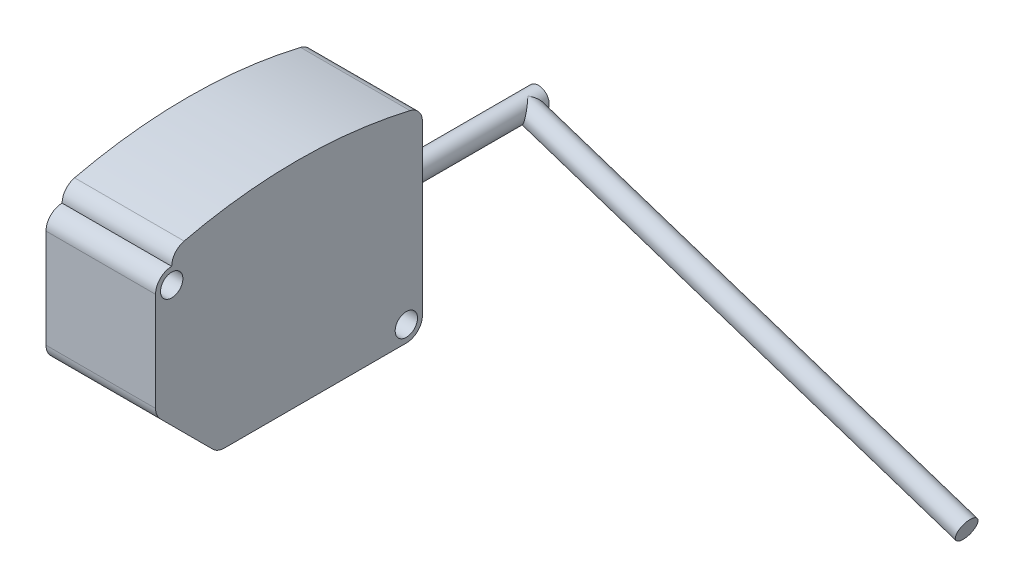
ISO-10303-21;
HEADER;
FILE_DESCRIPTION(('STEP AP214'),'2;1');
FILE_NAME('part.step','',(''),(''),'','','');
FILE_SCHEMA(('AUTOMOTIVE_DESIGN { 1 0 10303 214 1 1 1 1 }'));
ENDSEC;
DATA;
#1=APPLICATION_CONTEXT('core data for automotive mechanical design processes');
#2=APPLICATION_PROTOCOL_DEFINITION('international standard','automotive_design',2000,#1);
#3=PRODUCT_CONTEXT('',#1,'mechanical');
#4=PRODUCT('Part','Part','',(#3));
#5=PRODUCT_RELATED_PRODUCT_CATEGORY('part','',(#4));
#6=PRODUCT_DEFINITION_FORMATION('','',#4);
#7=PRODUCT_DEFINITION_CONTEXT('part definition',#1,'design');
#8=PRODUCT_DEFINITION('design','',#6,#7);
#9=PRODUCT_DEFINITION_SHAPE('','',#8);
#10=(LENGTH_UNIT() NAMED_UNIT(*) SI_UNIT(.MILLI.,.METRE.));
#11=(NAMED_UNIT(*) PLANE_ANGLE_UNIT() SI_UNIT($,.RADIAN.));
#12=(NAMED_UNIT(*) SI_UNIT($,.STERADIAN.) SOLID_ANGLE_UNIT());
#13=UNCERTAINTY_MEASURE_WITH_UNIT(LENGTH_MEASURE(1.E-05),#10,'distance_accuracy_value','');
#14=(GEOMETRIC_REPRESENTATION_CONTEXT(3) GLOBAL_UNCERTAINTY_ASSIGNED_CONTEXT((#13)) GLOBAL_UNIT_ASSIGNED_CONTEXT((#10,
#11,#12)) REPRESENTATION_CONTEXT('',''));
#15=CARTESIAN_POINT('',(0.,0.,0.));
#16=DIRECTION('',(0.,0.,1.));
#17=DIRECTION('',(1.,0.,0.));
#18=AXIS2_PLACEMENT_3D('',#15,#16,#17);
#19=CARTESIAN_POINT('',(0.,29.5,-55.));
#20=DIRECTION('',(0.,0.,1.));
#21=DIRECTION('',(0.,-1.,0.));
#22=AXIS2_PLACEMENT_3D('',#19,#20,#21);
#23=CYLINDRICAL_SURFACE('',#22,3.5);
#24=CARTESIAN_POINT('',(0.,29.5,0.));
#25=DIRECTION('',(0.,0.,1.));
#26=DIRECTION('',(0.,-1.,0.));
#27=AXIS2_PLACEMENT_3D('',#24,#25,#26);
#28=CIRCLE('',#27,3.5);
#29=CARTESIAN_POINT('',(0.,26.,0.));
#30=VERTEX_POINT('',#29);
#31=EDGE_CURVE('E202',#30,#30,#28,.F.);
#32=ORIENTED_EDGE('',*,*,#31,.T.);
#33=EDGE_LOOP('',(#32));
#34=FACE_BOUND('',#33,.T.);
#35=CARTESIAN_POINT('',(0.,29.5,-55.));
#36=DIRECTION('',(0.,0.,-1.));
#37=DIRECTION('',(0.,1.,0.));
#38=AXIS2_PLACEMENT_3D('',#35,#36,#37);
#39=CIRCLE('',#38,3.5);
#40=CARTESIAN_POINT('',(0.,33.,-55.));
#41=VERTEX_POINT('',#40);
#42=EDGE_CURVE('E369',#41,#41,#39,.T.);
#43=ORIENTED_EDGE('',*,*,#42,.F.);
#44=EDGE_LOOP('',(#43));
#45=FACE_BOUND('',#44,.T.);
#46=CARTESIAN_POINT('',(0.,29.5,-50.5154843800657));
#47=DIRECTION('',(-0.671564955952915,0.221360588036713,0.707106781186548));
#48=DIRECTION('',(0.671564955952915,-0.221360588036714,0.707106781186547));
#49=AXIS2_PLACEMENT_3D('',#46,#47,#48);
#50=ELLIPSE('',#49,4.94974746830583,3.5);
#51=CARTESIAN_POINT('',(1.09567901021741,32.8240769405309,-50.5154843800657));
#52=VERTEX_POINT('',#51);
#53=CARTESIAN_POINT('',(-1.09567901021742,26.1759230594692,-50.5154843800657));
#54=VERTEX_POINT('',#53);
#55=EDGE_CURVE('E11',#52,#54,#50,.F.);
#56=ORIENTED_EDGE('',*,*,#55,.F.);
#57=CARTESIAN_POINT('',(0.,29.5,-50.5154843800657));
#58=DIRECTION('',(0.671564955952915,-0.221360588036714,0.707106781186547));
#59=DIRECTION('',(-0.671564955952915,0.221360588036713,0.707106781186548));
#60=AXIS2_PLACEMENT_3D('',#57,#58,#59);
#61=ELLIPSE('',#60,4.94974746830583,3.5);
#62=EDGE_CURVE('E41',#54,#52,#61,.T.);
#63=ORIENTED_EDGE('',*,*,#62,.F.);
#64=EDGE_LOOP('',(#56,#63));
#65=FACE_BOUND('',#64,.T.);
#66=ADVANCED_FACE('F33',(#34,#45,#65),#23,.T.);
#67=CARTESIAN_POINT('',(17.65,59.2,0.));
#68=DIRECTION('',(0.,0.,1.));
#69=DIRECTION('',(0.,-1.,0.));
#70=AXIS2_PLACEMENT_3D('',#67,#68,#69);
#71=PLANE('',#70);
#72=DIRECTION('',(0.,1.,0.));
#73=VECTOR('',#72,1.);
#74=CARTESIAN_POINT('',(-17.65,59.2,0.));
#75=LINE('',#74,#73);
#76=CARTESIAN_POINT('',(-17.65,5.2,0.));
#77=VERTEX_POINT('',#76);
#78=CARTESIAN_POINT('',(-17.65,59.2,0.));
#79=VERTEX_POINT('',#78);
#80=EDGE_CURVE('E172',#77,#79,#75,.T.);
#81=ORIENTED_EDGE('',*,*,#80,.T.);
#82=DIRECTION('',(-1.,0.,0.));
#83=VECTOR('',#82,1.);
#84=CARTESIAN_POINT('',(17.65,59.2,0.));
#85=LINE('',#84,#83);
#86=CARTESIAN_POINT('',(17.65,59.2,0.));
#87=VERTEX_POINT('',#86);
#88=EDGE_CURVE('E147',#87,#79,#85,.T.);
#89=ORIENTED_EDGE('',*,*,#88,.F.);
#90=DIRECTION('',(0.,1.,0.));
#91=VECTOR('',#90,1.);
#92=CARTESIAN_POINT('',(17.65,59.2,0.));
#93=LINE('',#92,#91);
#94=CARTESIAN_POINT('',(17.65,5.2,0.));
#95=VERTEX_POINT('',#94);
#96=EDGE_CURVE('E135',#95,#87,#93,.T.);
#97=ORIENTED_EDGE('',*,*,#96,.F.);
#98=DIRECTION('',(-1.,0.,0.));
#99=VECTOR('',#98,1.);
#100=CARTESIAN_POINT('',(17.65,5.2,0.));
#101=LINE('',#100,#99);
#102=EDGE_CURVE('E182',#95,#77,#101,.T.);
#103=ORIENTED_EDGE('',*,*,#102,.T.);
#104=EDGE_LOOP('',(#81,#89,#97,#103));
#105=FACE_BOUND('',#104,.T.);
#106=ORIENTED_EDGE('',*,*,#31,.F.);
#107=EDGE_LOOP('',(#106));
#108=FACE_BOUND('',#107,.T.);
#109=ADVANCED_FACE('F225',(#105,#108),#71,.F.);
#110=CARTESIAN_POINT('',(-17.65,54.,80.8));
#111=DIRECTION('',(1.,0.,0.));
#112=DIRECTION('',(0.,0.,-1.));
#113=AXIS2_PLACEMENT_3D('',#110,#111,#112);
#114=PLANE('',#113);
#115=CARTESIAN_POINT('',(-17.65,54.,80.8));
#116=DIRECTION('',(1.,0.,0.));
#117=DIRECTION('',(0.,0.,-1.));
#118=AXIS2_PLACEMENT_3D('',#115,#116,#117);
#119=CIRCLE('',#118,3.6);
#120=CARTESIAN_POINT('',(-17.65,54.,77.2));
#121=VERTEX_POINT('',#120);
#122=EDGE_CURVE('E219',#121,#121,#119,.T.);
#123=ORIENTED_EDGE('',*,*,#122,.T.);
#124=EDGE_LOOP('',(#123));
#125=FACE_BOUND('',#124,.T.);
#126=CARTESIAN_POINT('',(-17.65,54.,80.8));
#127=DIRECTION('',(1.,0.,0.));
#128=DIRECTION('',(0.,0.,-1.));
#129=AXIS2_PLACEMENT_3D('',#126,#127,#128);
#130=CIRCLE('',#129,5.19999999999999);
#131=CARTESIAN_POINT('',(-17.65,59.2,80.8));
#132=VERTEX_POINT('',#131);
#133=CARTESIAN_POINT('',(-17.65,54.,86.));
#134=VERTEX_POINT('',#133);
#135=EDGE_CURVE('E156',#132,#134,#130,.T.);
#136=ORIENTED_EDGE('',*,*,#135,.F.);
#137=CARTESIAN_POINT('',(-17.65,59.2,75.6));
#138=DIRECTION('',(1.,0.,0.));
#139=DIRECTION('',(0.,0.,-1.));
#140=AXIS2_PLACEMENT_3D('',#137,#138,#139);
#141=CIRCLE('',#140,5.2);
#142=CARTESIAN_POINT('',(-17.65,64.2607922920731,76.7951491022017));
#143=VERTEX_POINT('',#142);
#144=EDGE_CURVE('E96',#143,#132,#141,.T.);
#145=ORIENTED_EDGE('',*,*,#144,.F.);
#146=CARTESIAN_POINT('',(-17.65,-89.8524390243884,40.3999999999999));
#147=DIRECTION('',(1.,0.,0.));
#148=DIRECTION('',(0.,0.,-1.));
#149=AXIS2_PLACEMENT_3D('',#146,#147,#148);
#150=CIRCLE('',#149,158.352439024388);
#151=CARTESIAN_POINT('',(-17.65,64.2607922920731,4.00485089779829));
#152=VERTEX_POINT('',#151);
#153=EDGE_CURVE('E175',#152,#143,#150,.T.);
#154=ORIENTED_EDGE('',*,*,#153,.F.);
#155=CARTESIAN_POINT('',(-17.65,59.2,5.19999999999999));
#156=DIRECTION('',(1.,0.,0.));
#157=DIRECTION('',(0.,0.,1.));
#158=AXIS2_PLACEMENT_3D('',#155,#156,#157);
#159=CIRCLE('',#158,5.19999999999999);
#160=EDGE_CURVE('E144',#79,#152,#159,.T.);
#161=ORIENTED_EDGE('',*,*,#160,.F.);
#162=ORIENTED_EDGE('',*,*,#80,.F.);
#163=CARTESIAN_POINT('',(-17.65,5.2,5.2));
#164=DIRECTION('',(1.,0.,0.));
#165=DIRECTION('',(0.,0.,1.));
#166=AXIS2_PLACEMENT_3D('',#163,#164,#165);
#167=CIRCLE('',#166,5.2);
#168=CARTESIAN_POINT('',(-17.65,0.,5.19999999999999));
#169=VERTEX_POINT('',#168);
#170=EDGE_CURVE('E170',#169,#77,#167,.T.);
#171=ORIENTED_EDGE('',*,*,#170,.F.);
#172=DIRECTION('',(0.,0.,-1.));
#173=VECTOR('',#172,1.);
#174=CARTESIAN_POINT('',(-17.65,0.,5.19999999999999));
#175=LINE('',#174,#173);
#176=CARTESIAN_POINT('',(-17.65,0.,63.8460894756599));
#177=VERTEX_POINT('',#176);
#178=EDGE_CURVE('E168',#177,#169,#175,.T.);
#179=ORIENTED_EDGE('',*,*,#178,.F.);
#180=CARTESIAN_POINT('',(-17.65,5.19999999999999,63.8460894756599));
#181=DIRECTION('',(1.,0.,0.));
#182=DIRECTION('',(0.,0.,-1.));
#183=AXIS2_PLACEMENT_3D('',#180,#181,#182);
#184=CIRCLE('',#183,5.2);
#185=CARTESIAN_POINT('',(-17.65,1.52304473782994,67.5230447378299));
#186=VERTEX_POINT('',#185);
#187=EDGE_CURVE('E166',#186,#177,#184,.T.);
#188=ORIENTED_EDGE('',*,*,#187,.F.);
#189=DIRECTION('',(0.,-0.707106781186547,-0.707106781186548));
#190=VECTOR('',#189,1.);
#191=CARTESIAN_POINT('',(-17.65,1.52304473782994,67.5230447378299));
#192=LINE('',#191,#190);
#193=CARTESIAN_POINT('',(-17.65,18.47695526217,84.47695526217));
#194=VERTEX_POINT('',#193);
#195=EDGE_CURVE('E164',#194,#186,#192,.T.);
#196=ORIENTED_EDGE('',*,*,#195,.F.);
#197=CARTESIAN_POINT('',(-17.65,22.1539105243401,80.8));
#198=DIRECTION('',(1.,0.,0.));
#199=DIRECTION('',(0.,0.,1.));
#200=AXIS2_PLACEMENT_3D('',#197,#198,#199);
#201=CIRCLE('',#200,5.2);
#202=CARTESIAN_POINT('',(-17.65,22.1539105243401,86.));
#203=VERTEX_POINT('',#202);
#204=EDGE_CURVE('E162',#203,#194,#201,.T.);
#205=ORIENTED_EDGE('',*,*,#204,.F.);
#206=DIRECTION('',(0.,-1.,0.));
#207=VECTOR('',#206,1.);
#208=CARTESIAN_POINT('',(-17.65,22.1539105243401,86.));
#209=LINE('',#208,#207);
#210=EDGE_CURVE('E159',#134,#203,#209,.T.);
#211=ORIENTED_EDGE('',*,*,#210,.F.);
#212=EDGE_LOOP('',(#136,#145,#154,#161,#162,#171,#179,#188,#196,#205,#211));
#213=FACE_BOUND('',#212,.T.);
#214=CARTESIAN_POINT('',(-17.65,5.2,5.2));
#215=DIRECTION('',(1.,0.,0.));
#216=DIRECTION('',(0.,0.,-1.));
#217=AXIS2_PLACEMENT_3D('',#214,#215,#216);
#218=CIRCLE('',#217,3.6);
#219=CARTESIAN_POINT('',(-17.65,5.2,1.6));
#220=VERTEX_POINT('',#219);
#221=EDGE_CURVE('E366',#220,#220,#218,.T.);
#222=ORIENTED_EDGE('',*,*,#221,.T.);
#223=EDGE_LOOP('',(#222));
#224=FACE_BOUND('',#223,.T.);
#225=ADVANCED_FACE('F233',(#125,#213,#224),#114,.F.);
#226=CARTESIAN_POINT('',(17.65,5.2,5.2));
#227=DIRECTION('',(-1.,0.,0.));
#228=DIRECTION('',(0.,0.,1.));
#229=AXIS2_PLACEMENT_3D('',#226,#227,#228);
#230=CYLINDRICAL_SURFACE('',#229,2.25);
#231=CARTESIAN_POINT('',(11.65,5.2,5.2));
#232=DIRECTION('',(1.,0.,0.));
#233=DIRECTION('',(0.,0.,-1.));
#234=AXIS2_PLACEMENT_3D('',#231,#232,#233);
#235=CIRCLE('',#234,2.25);
#236=CARTESIAN_POINT('',(11.65,5.2,2.95));
#237=VERTEX_POINT('',#236);
#238=EDGE_CURVE('E206',#237,#237,#235,.T.);
#239=ORIENTED_EDGE('',*,*,#238,.T.);
#240=EDGE_LOOP('',(#239));
#241=FACE_BOUND('',#240,.T.);
#242=CARTESIAN_POINT('',(-11.65,5.2,5.2));
#243=DIRECTION('',(-1.,0.,0.));
#244=DIRECTION('',(0.,0.,1.));
#245=AXIS2_PLACEMENT_3D('',#242,#243,#244);
#246=CIRCLE('',#245,2.25);
#247=CARTESIAN_POINT('',(-11.65,5.2,7.45));
#248=VERTEX_POINT('',#247);
#249=EDGE_CURVE('E216',#248,#248,#246,.T.);
#250=ORIENTED_EDGE('',*,*,#249,.T.);
#251=EDGE_LOOP('',(#250));
#252=FACE_BOUND('',#251,.T.);
#253=ADVANCED_FACE('F274',(#241,#252),#230,.F.);
#254=CARTESIAN_POINT('',(17.65,54.,80.8));
#255=DIRECTION('',(-1.,0.,0.));
#256=DIRECTION('',(0.,0.,1.));
#257=AXIS2_PLACEMENT_3D('',#254,#255,#256);
#258=CYLINDRICAL_SURFACE('',#257,2.25);
#259=CARTESIAN_POINT('',(11.65,54.,80.8));
#260=DIRECTION('',(1.,0.,0.));
#261=DIRECTION('',(0.,0.,-1.));
#262=AXIS2_PLACEMENT_3D('',#259,#260,#261);
#263=CIRCLE('',#262,2.25);
#264=CARTESIAN_POINT('',(11.65,54.,78.55));
#265=VERTEX_POINT('',#264);
#266=EDGE_CURVE('E160',#265,#265,#263,.T.);
#267=ORIENTED_EDGE('',*,*,#266,.T.);
#268=EDGE_LOOP('',(#267));
#269=FACE_BOUND('',#268,.T.);
#270=CARTESIAN_POINT('',(-11.65,54.,80.8));
#271=DIRECTION('',(-1.,0.,0.));
#272=DIRECTION('',(0.,0.,1.));
#273=AXIS2_PLACEMENT_3D('',#270,#271,#272);
#274=CIRCLE('',#273,2.25);
#275=CARTESIAN_POINT('',(-11.65,54.,83.05));
#276=VERTEX_POINT('',#275);
#277=EDGE_CURVE('E211',#276,#276,#274,.T.);
#278=ORIENTED_EDGE('',*,*,#277,.T.);
#279=EDGE_LOOP('',(#278));
#280=FACE_BOUND('',#279,.T.);
#281=ADVANCED_FACE('F277',(#269,#280),#258,.F.);
#282=CARTESIAN_POINT('',(17.65,54.,80.8));
#283=DIRECTION('',(1.,0.,0.));
#284=DIRECTION('',(0.,0.,-1.));
#285=AXIS2_PLACEMENT_3D('',#282,#283,#284);
#286=PLANE('',#285);
#287=CARTESIAN_POINT('',(17.65,5.2,5.2));
#288=DIRECTION('',(1.,0.,0.));
#289=DIRECTION('',(0.,0.,-1.));
#290=AXIS2_PLACEMENT_3D('',#287,#288,#289);
#291=CIRCLE('',#290,3.6);
#292=CARTESIAN_POINT('',(17.65,5.2,1.6));
#293=VERTEX_POINT('',#292);
#294=EDGE_CURVE('E214',#293,#293,#291,.T.);
#295=ORIENTED_EDGE('',*,*,#294,.F.);
#296=EDGE_LOOP('',(#295));
#297=FACE_BOUND('',#296,.T.);
#298=CARTESIAN_POINT('',(17.65,54.,80.8));
#299=DIRECTION('',(1.,0.,0.));
#300=DIRECTION('',(0.,0.,-1.));
#301=AXIS2_PLACEMENT_3D('',#298,#299,#300);
#302=CIRCLE('',#301,3.6);
#303=CARTESIAN_POINT('',(17.65,54.,77.2));
#304=VERTEX_POINT('',#303);
#305=EDGE_CURVE('E209',#304,#304,#302,.T.);
#306=ORIENTED_EDGE('',*,*,#305,.F.);
#307=EDGE_LOOP('',(#306));
#308=FACE_BOUND('',#307,.T.);
#309=CARTESIAN_POINT('',(17.65,54.,80.8));
#310=DIRECTION('',(1.,0.,0.));
#311=DIRECTION('',(0.,0.,-1.));
#312=AXIS2_PLACEMENT_3D('',#309,#310,#311);
#313=CIRCLE('',#312,5.19999999999999);
#314=CARTESIAN_POINT('',(17.65,59.2,80.8));
#315=VERTEX_POINT('',#314);
#316=CARTESIAN_POINT('',(17.65,54.,86.));
#317=VERTEX_POINT('',#316);
#318=EDGE_CURVE('E178',#315,#317,#313,.T.);
#319=ORIENTED_EDGE('',*,*,#318,.T.);
#320=DIRECTION('',(0.,-1.,0.));
#321=VECTOR('',#320,1.);
#322=CARTESIAN_POINT('',(17.65,22.1539105243401,86.));
#323=LINE('',#322,#321);
#324=CARTESIAN_POINT('',(17.65,22.1539105243401,86.));
#325=VERTEX_POINT('',#324);
#326=EDGE_CURVE('E105',#317,#325,#323,.T.);
#327=ORIENTED_EDGE('',*,*,#326,.T.);
#328=CARTESIAN_POINT('',(17.65,22.1539105243401,80.8));
#329=DIRECTION('',(1.,0.,0.));
#330=DIRECTION('',(0.,0.,1.));
#331=AXIS2_PLACEMENT_3D('',#328,#329,#330);
#332=CIRCLE('',#331,5.2);
#333=CARTESIAN_POINT('',(17.65,18.47695526217,84.47695526217));
#334=VERTEX_POINT('',#333);
#335=EDGE_CURVE('E325',#325,#334,#332,.T.);
#336=ORIENTED_EDGE('',*,*,#335,.T.);
#337=DIRECTION('',(0.,-0.707106781186547,-0.707106781186548));
#338=VECTOR('',#337,1.);
#339=CARTESIAN_POINT('',(17.65,1.52304473782994,67.5230447378299));
#340=LINE('',#339,#338);
#341=CARTESIAN_POINT('',(17.65,1.52304473782994,67.5230447378299));
#342=VERTEX_POINT('',#341);
#343=EDGE_CURVE('E337',#334,#342,#340,.T.);
#344=ORIENTED_EDGE('',*,*,#343,.T.);
#345=CARTESIAN_POINT('',(17.65,5.19999999999999,63.8460894756599));
#346=DIRECTION('',(1.,0.,0.));
#347=DIRECTION('',(0.,0.,-1.));
#348=AXIS2_PLACEMENT_3D('',#345,#346,#347);
#349=CIRCLE('',#348,5.2);
#350=CARTESIAN_POINT('',(17.65,0.,63.8460894756599));
#351=VERTEX_POINT('',#350);
#352=EDGE_CURVE('E334',#342,#351,#349,.T.);
#353=ORIENTED_EDGE('',*,*,#352,.T.);
#354=DIRECTION('',(0.,0.,-1.));
#355=VECTOR('',#354,1.);
#356=CARTESIAN_POINT('',(17.65,0.,5.19999999999999));
#357=LINE('',#356,#355);
#358=CARTESIAN_POINT('',(17.65,0.,5.19999999999999));
#359=VERTEX_POINT('',#358);
#360=EDGE_CURVE('E336',#351,#359,#357,.T.);
#361=ORIENTED_EDGE('',*,*,#360,.T.);
#362=CARTESIAN_POINT('',(17.65,5.2,5.2));
#363=DIRECTION('',(1.,0.,0.));
#364=DIRECTION('',(0.,0.,1.));
#365=AXIS2_PLACEMENT_3D('',#362,#363,#364);
#366=CIRCLE('',#365,5.2);
#367=EDGE_CURVE('E339',#359,#95,#366,.T.);
#368=ORIENTED_EDGE('',*,*,#367,.T.);
#369=ORIENTED_EDGE('',*,*,#96,.T.);
#370=CARTESIAN_POINT('',(17.65,59.2,5.19999999999999));
#371=DIRECTION('',(1.,0.,0.));
#372=DIRECTION('',(0.,0.,1.));
#373=AXIS2_PLACEMENT_3D('',#370,#371,#372);
#374=CIRCLE('',#373,5.19999999999999);
#375=CARTESIAN_POINT('',(17.65,64.2607922920731,4.00485089779829));
#376=VERTEX_POINT('',#375);
#377=EDGE_CURVE('E128',#87,#376,#374,.T.);
#378=ORIENTED_EDGE('',*,*,#377,.T.);
#379=CARTESIAN_POINT('',(17.65,-89.8524390243884,40.3999999999999));
#380=DIRECTION('',(1.,0.,0.));
#381=DIRECTION('',(0.,0.,-1.));
#382=AXIS2_PLACEMENT_3D('',#379,#380,#381);
#383=CIRCLE('',#382,158.352439024388);
#384=CARTESIAN_POINT('',(17.65,64.2607922920731,76.7951491022017));
#385=VERTEX_POINT('',#384);
#386=EDGE_CURVE('E132',#376,#385,#383,.T.);
#387=ORIENTED_EDGE('',*,*,#386,.T.);
#388=CARTESIAN_POINT('',(17.65,59.2,75.6));
#389=DIRECTION('',(1.,0.,0.));
#390=DIRECTION('',(0.,0.,-1.));
#391=AXIS2_PLACEMENT_3D('',#388,#389,#390);
#392=CIRCLE('',#391,5.2);
#393=EDGE_CURVE('E54',#385,#315,#392,.T.);
#394=ORIENTED_EDGE('',*,*,#393,.T.);
#395=EDGE_LOOP('',(#319,#327,#336,#344,#353,#361,#368,#369,#378,#387,#394));
#396=FACE_BOUND('',#395,.T.);
#397=ADVANCED_FACE('F130',(#297,#308,#396),#286,.T.);
#398=CARTESIAN_POINT('',(17.65,54.,80.8));
#399=DIRECTION('',(-1.,0.,0.));
#400=DIRECTION('',(0.,0.,1.));
#401=AXIS2_PLACEMENT_3D('',#398,#399,#400);
#402=CYLINDRICAL_SURFACE('',#401,5.19999999999999);
#403=ORIENTED_EDGE('',*,*,#135,.T.);
#404=DIRECTION('',(-1.,0.,0.));
#405=VECTOR('',#404,1.);
#406=CARTESIAN_POINT('',(17.65,54.,86.));
#407=LINE('',#406,#405);
#408=EDGE_CURVE('E200',#317,#134,#407,.T.);
#409=ORIENTED_EDGE('',*,*,#408,.F.);
#410=ORIENTED_EDGE('',*,*,#318,.F.);
#411=DIRECTION('',(-1.,0.,0.));
#412=VECTOR('',#411,1.);
#413=CARTESIAN_POINT('',(17.65,59.2,80.8));
#414=LINE('',#413,#412);
#415=EDGE_CURVE('E152',#315,#132,#414,.T.);
#416=ORIENTED_EDGE('',*,*,#415,.T.);
#417=EDGE_LOOP('',(#403,#409,#410,#416));
#418=FACE_BOUND('',#417,.T.);
#419=ADVANCED_FACE('F35',(#418),#402,.T.);
#420=CARTESIAN_POINT('',(17.65,22.1539105243401,86.));
#421=DIRECTION('',(0.,0.,-1.));
#422=DIRECTION('',(-1.,0.,0.));
#423=AXIS2_PLACEMENT_3D('',#420,#421,#422);
#424=PLANE('',#423);
#425=ORIENTED_EDGE('',*,*,#210,.T.);
#426=DIRECTION('',(-1.,0.,0.));
#427=VECTOR('',#426,1.);
#428=CARTESIAN_POINT('',(17.65,22.1539105243401,86.));
#429=LINE('',#428,#427);
#430=EDGE_CURVE('E197',#325,#203,#429,.T.);
#431=ORIENTED_EDGE('',*,*,#430,.F.);
#432=ORIENTED_EDGE('',*,*,#326,.F.);
#433=ORIENTED_EDGE('',*,*,#408,.T.);
#434=EDGE_LOOP('',(#425,#431,#432,#433));
#435=FACE_BOUND('',#434,.T.);
#436=ADVANCED_FACE('F312',(#435),#424,.F.);
#437=CARTESIAN_POINT('',(17.65,22.1539105243401,80.8));
#438=DIRECTION('',(-1.,0.,0.));
#439=DIRECTION('',(0.,0.,1.));
#440=AXIS2_PLACEMENT_3D('',#437,#438,#439);
#441=CYLINDRICAL_SURFACE('',#440,5.2);
#442=ORIENTED_EDGE('',*,*,#204,.T.);
#443=DIRECTION('',(-1.,0.,0.));
#444=VECTOR('',#443,1.);
#445=CARTESIAN_POINT('',(17.65,18.47695526217,84.47695526217));
#446=LINE('',#445,#444);
#447=EDGE_CURVE('E194',#334,#194,#446,.T.);
#448=ORIENTED_EDGE('',*,*,#447,.F.);
#449=ORIENTED_EDGE('',*,*,#335,.F.);
#450=ORIENTED_EDGE('',*,*,#430,.T.);
#451=EDGE_LOOP('',(#442,#448,#449,#450));
#452=FACE_BOUND('',#451,.T.);
#453=ADVANCED_FACE('F309',(#452),#441,.T.);
#454=CARTESIAN_POINT('',(17.65,1.52304473782994,67.5230447378299));
#455=DIRECTION('',(0.,0.707106781186548,-0.707106781186547));
#456=DIRECTION('',(0.,0.707106781186547,0.707106781186548));
#457=AXIS2_PLACEMENT_3D('',#454,#455,#456);
#458=PLANE('',#457);
#459=ORIENTED_EDGE('',*,*,#195,.T.);
#460=DIRECTION('',(-1.,0.,0.));
#461=VECTOR('',#460,1.);
#462=CARTESIAN_POINT('',(17.65,1.52304473782994,67.5230447378299));
#463=LINE('',#462,#461);
#464=EDGE_CURVE('E191',#342,#186,#463,.T.);
#465=ORIENTED_EDGE('',*,*,#464,.F.);
#466=ORIENTED_EDGE('',*,*,#343,.F.);
#467=ORIENTED_EDGE('',*,*,#447,.T.);
#468=EDGE_LOOP('',(#459,#465,#466,#467));
#469=FACE_BOUND('',#468,.T.);
#470=ADVANCED_FACE('F305',(#469),#458,.F.);
#471=CARTESIAN_POINT('',(17.65,5.19999999999999,63.8460894756599));
#472=DIRECTION('',(-1.,0.,0.));
#473=DIRECTION('',(0.,0.,1.));
#474=AXIS2_PLACEMENT_3D('',#471,#472,#473);
#475=CYLINDRICAL_SURFACE('',#474,5.2);
#476=ORIENTED_EDGE('',*,*,#187,.T.);
#477=DIRECTION('',(-1.,0.,0.));
#478=VECTOR('',#477,1.);
#479=CARTESIAN_POINT('',(17.65,0.,63.8460894756599));
#480=LINE('',#479,#478);
#481=EDGE_CURVE('E188',#351,#177,#480,.T.);
#482=ORIENTED_EDGE('',*,*,#481,.F.);
#483=ORIENTED_EDGE('',*,*,#352,.F.);
#484=ORIENTED_EDGE('',*,*,#464,.T.);
#485=EDGE_LOOP('',(#476,#482,#483,#484));
#486=FACE_BOUND('',#485,.T.);
#487=ADVANCED_FACE('F301',(#486),#475,.T.);
#488=CARTESIAN_POINT('',(17.65,0.,5.19999999999999));
#489=DIRECTION('',(0.,1.,0.));
#490=DIRECTION('',(0.,0.,1.));
#491=AXIS2_PLACEMENT_3D('',#488,#489,#490);
#492=PLANE('',#491);
#493=ORIENTED_EDGE('',*,*,#178,.T.);
#494=DIRECTION('',(-1.,0.,0.));
#495=VECTOR('',#494,1.);
#496=CARTESIAN_POINT('',(17.65,0.,5.19999999999999));
#497=LINE('',#496,#495);
#498=EDGE_CURVE('E185',#359,#169,#497,.T.);
#499=ORIENTED_EDGE('',*,*,#498,.F.);
#500=ORIENTED_EDGE('',*,*,#360,.F.);
#501=ORIENTED_EDGE('',*,*,#481,.T.);
#502=EDGE_LOOP('',(#493,#499,#500,#501));
#503=FACE_BOUND('',#502,.T.);
#504=ADVANCED_FACE('F297',(#503),#492,.F.);
#505=CARTESIAN_POINT('',(17.65,5.2,5.2));
#506=DIRECTION('',(-1.,0.,0.));
#507=DIRECTION('',(0.,0.,1.));
#508=AXIS2_PLACEMENT_3D('',#505,#506,#507);
#509=CYLINDRICAL_SURFACE('',#508,5.2);
#510=ORIENTED_EDGE('',*,*,#170,.T.);
#511=ORIENTED_EDGE('',*,*,#102,.F.);
#512=ORIENTED_EDGE('',*,*,#367,.F.);
#513=ORIENTED_EDGE('',*,*,#498,.T.);
#514=EDGE_LOOP('',(#510,#511,#512,#513));
#515=FACE_BOUND('',#514,.T.);
#516=ADVANCED_FACE('F293',(#515),#509,.T.);
#517=CARTESIAN_POINT('',(17.65,59.2,5.19999999999999));
#518=DIRECTION('',(-1.,0.,0.));
#519=DIRECTION('',(0.,0.,1.));
#520=AXIS2_PLACEMENT_3D('',#517,#518,#519);
#521=CYLINDRICAL_SURFACE('',#520,5.19999999999999);
#522=ORIENTED_EDGE('',*,*,#160,.T.);
#523=DIRECTION('',(-1.,0.,0.));
#524=VECTOR('',#523,1.);
#525=CARTESIAN_POINT('',(17.65,64.2607922920731,4.00485089779829));
#526=LINE('',#525,#524);
#527=EDGE_CURVE('E141',#376,#152,#526,.T.);
#528=ORIENTED_EDGE('',*,*,#527,.F.);
#529=ORIENTED_EDGE('',*,*,#377,.F.);
#530=ORIENTED_EDGE('',*,*,#88,.T.);
#531=EDGE_LOOP('',(#522,#528,#529,#530));
#532=FACE_BOUND('',#531,.T.);
#533=ADVANCED_FACE('F142',(#532),#521,.T.);
#534=CARTESIAN_POINT('',(17.65,-89.8524390243884,40.3999999999999));
#535=DIRECTION('',(-1.,0.,0.));
#536=DIRECTION('',(0.,0.,1.));
#537=AXIS2_PLACEMENT_3D('',#534,#535,#536);
#538=CYLINDRICAL_SURFACE('',#537,158.352439024388);
#539=ORIENTED_EDGE('',*,*,#153,.T.);
#540=DIRECTION('',(-1.,0.,0.));
#541=VECTOR('',#540,1.);
#542=CARTESIAN_POINT('',(17.65,64.2607922920731,76.7951491022017));
#543=LINE('',#542,#541);
#544=EDGE_CURVE('E148',#385,#143,#543,.T.);
#545=ORIENTED_EDGE('',*,*,#544,.F.);
#546=ORIENTED_EDGE('',*,*,#386,.F.);
#547=ORIENTED_EDGE('',*,*,#527,.T.);
#548=EDGE_LOOP('',(#539,#545,#546,#547));
#549=FACE_BOUND('',#548,.T.);
#550=ADVANCED_FACE('F150',(#549),#538,.T.);
#551=CARTESIAN_POINT('',(17.65,59.2,75.6));
#552=DIRECTION('',(-1.,0.,0.));
#553=DIRECTION('',(0.,0.,1.));
#554=AXIS2_PLACEMENT_3D('',#551,#552,#553);
#555=CYLINDRICAL_SURFACE('',#554,5.2);
#556=ORIENTED_EDGE('',*,*,#144,.T.);
#557=ORIENTED_EDGE('',*,*,#415,.F.);
#558=ORIENTED_EDGE('',*,*,#393,.F.);
#559=ORIENTED_EDGE('',*,*,#544,.T.);
#560=EDGE_LOOP('',(#556,#557,#558,#559));
#561=FACE_BOUND('',#560,.T.);
#562=ADVANCED_FACE('F272',(#561),#555,.T.);
#563=CARTESIAN_POINT('',(11.65,54.,80.8));
#564=DIRECTION('',(1.,0.,0.));
#565=DIRECTION('',(0.,0.,-1.));
#566=AXIS2_PLACEMENT_3D('',#563,#564,#565);
#567=CYLINDRICAL_SURFACE('',#566,3.6);
#568=CARTESIAN_POINT('',(11.65,54.,80.8));
#569=DIRECTION('',(1.,0.,0.));
#570=DIRECTION('',(0.,0.,-1.));
#571=AXIS2_PLACEMENT_3D('',#568,#569,#570);
#572=CIRCLE('',#571,3.6);
#573=CARTESIAN_POINT('',(11.65,54.,77.2));
#574=VERTEX_POINT('',#573);
#575=EDGE_CURVE('E205',#574,#574,#572,.T.);
#576=ORIENTED_EDGE('',*,*,#575,.F.);
#577=EDGE_LOOP('',(#576));
#578=FACE_BOUND('',#577,.T.);
#579=ORIENTED_EDGE('',*,*,#305,.T.);
#580=EDGE_LOOP('',(#579));
#581=FACE_BOUND('',#580,.T.);
#582=ADVANCED_FACE('F268',(#578,#581),#567,.F.);
#583=CARTESIAN_POINT('',(11.65,54.,80.8));
#584=DIRECTION('',(1.,0.,0.));
#585=DIRECTION('',(0.,0.,-1.));
#586=AXIS2_PLACEMENT_3D('',#583,#584,#585);
#587=PLANE('',#586);
#588=ORIENTED_EDGE('',*,*,#266,.F.);
#589=EDGE_LOOP('',(#588));
#590=FACE_BOUND('',#589,.T.);
#591=ORIENTED_EDGE('',*,*,#575,.T.);
#592=EDGE_LOOP('',(#591));
#593=FACE_BOUND('',#592,.T.);
#594=ADVANCED_FACE('F264',(#590,#593),#587,.T.);
#595=CARTESIAN_POINT('',(11.65,5.2,5.2));
#596=DIRECTION('',(1.,0.,0.));
#597=DIRECTION('',(0.,0.,-1.));
#598=AXIS2_PLACEMENT_3D('',#595,#596,#597);
#599=CYLINDRICAL_SURFACE('',#598,3.6);
#600=CARTESIAN_POINT('',(11.65,5.2,5.2));
#601=DIRECTION('',(1.,0.,0.));
#602=DIRECTION('',(0.,0.,-1.));
#603=AXIS2_PLACEMENT_3D('',#600,#601,#602);
#604=CIRCLE('',#603,3.6);
#605=CARTESIAN_POINT('',(11.65,5.2,1.6));
#606=VERTEX_POINT('',#605);
#607=EDGE_CURVE('E210',#606,#606,#604,.T.);
#608=ORIENTED_EDGE('',*,*,#607,.F.);
#609=EDGE_LOOP('',(#608));
#610=FACE_BOUND('',#609,.T.);
#611=ORIENTED_EDGE('',*,*,#294,.T.);
#612=EDGE_LOOP('',(#611));
#613=FACE_BOUND('',#612,.T.);
#614=ADVANCED_FACE('F260',(#610,#613),#599,.F.);
#615=CARTESIAN_POINT('',(11.65,5.2,5.2));
#616=DIRECTION('',(1.,0.,0.));
#617=DIRECTION('',(0.,0.,-1.));
#618=AXIS2_PLACEMENT_3D('',#615,#616,#617);
#619=PLANE('',#618);
#620=ORIENTED_EDGE('',*,*,#238,.F.);
#621=EDGE_LOOP('',(#620));
#622=FACE_BOUND('',#621,.T.);
#623=ORIENTED_EDGE('',*,*,#607,.T.);
#624=EDGE_LOOP('',(#623));
#625=FACE_BOUND('',#624,.T.);
#626=ADVANCED_FACE('F256',(#622,#625),#619,.T.);
#627=CARTESIAN_POINT('',(-11.65,54.,80.8));
#628=DIRECTION('',(-1.,0.,0.));
#629=DIRECTION('',(0.,0.,1.));
#630=AXIS2_PLACEMENT_3D('',#627,#628,#629);
#631=CYLINDRICAL_SURFACE('',#630,3.6);
#632=CARTESIAN_POINT('',(-11.65,54.,80.8));
#633=DIRECTION('',(1.,0.,0.));
#634=DIRECTION('',(0.,0.,-1.));
#635=AXIS2_PLACEMENT_3D('',#632,#633,#634);
#636=CIRCLE('',#635,3.6);
#637=CARTESIAN_POINT('',(-11.65,54.,77.2));
#638=VERTEX_POINT('',#637);
#639=EDGE_CURVE('E215',#638,#638,#636,.T.);
#640=ORIENTED_EDGE('',*,*,#639,.T.);
#641=EDGE_LOOP('',(#640));
#642=FACE_BOUND('',#641,.T.);
#643=ORIENTED_EDGE('',*,*,#122,.F.);
#644=EDGE_LOOP('',(#643));
#645=FACE_BOUND('',#644,.T.);
#646=ADVANCED_FACE('F252',(#642,#645),#631,.F.);
#647=CARTESIAN_POINT('',(-11.65,54.,80.8));
#648=DIRECTION('',(-1.,0.,0.));
#649=DIRECTION('',(0.,0.,-1.));
#650=AXIS2_PLACEMENT_3D('',#647,#648,#649);
#651=PLANE('',#650);
#652=ORIENTED_EDGE('',*,*,#277,.F.);
#653=EDGE_LOOP('',(#652));
#654=FACE_BOUND('',#653,.T.);
#655=ORIENTED_EDGE('',*,*,#639,.F.);
#656=EDGE_LOOP('',(#655));
#657=FACE_BOUND('',#656,.T.);
#658=ADVANCED_FACE('F248',(#654,#657),#651,.T.);
#659=CARTESIAN_POINT('',(-11.65,5.2,5.2));
#660=DIRECTION('',(-1.,0.,0.));
#661=DIRECTION('',(0.,0.,1.));
#662=AXIS2_PLACEMENT_3D('',#659,#660,#661);
#663=CYLINDRICAL_SURFACE('',#662,3.6);
#664=CARTESIAN_POINT('',(-11.65,5.2,5.2));
#665=DIRECTION('',(1.,0.,0.));
#666=DIRECTION('',(0.,0.,-1.));
#667=AXIS2_PLACEMENT_3D('',#664,#665,#666);
#668=CIRCLE('',#667,3.6);
#669=CARTESIAN_POINT('',(-11.65,5.2,1.6));
#670=VERTEX_POINT('',#669);
#671=EDGE_CURVE('E220',#670,#670,#668,.T.);
#672=ORIENTED_EDGE('',*,*,#671,.T.);
#673=EDGE_LOOP('',(#672));
#674=FACE_BOUND('',#673,.T.);
#675=ORIENTED_EDGE('',*,*,#221,.F.);
#676=EDGE_LOOP('',(#675));
#677=FACE_BOUND('',#676,.T.);
#678=ADVANCED_FACE('F244',(#674,#677),#663,.F.);
#679=CARTESIAN_POINT('',(-11.65,5.2,5.2));
#680=DIRECTION('',(-1.,0.,0.));
#681=DIRECTION('',(0.,0.,-1.));
#682=AXIS2_PLACEMENT_3D('',#679,#680,#681);
#683=PLANE('',#682);
#684=ORIENTED_EDGE('',*,*,#249,.F.);
#685=EDGE_LOOP('',(#684));
#686=FACE_BOUND('',#685,.T.);
#687=ORIENTED_EDGE('',*,*,#671,.F.);
#688=EDGE_LOOP('',(#687));
#689=FACE_BOUND('',#688,.T.);
#690=ADVANCED_FACE('F241',(#686,#689),#683,.T.);
#691=CARTESIAN_POINT('',(0.,29.5,-55.));
#692=DIRECTION('',(0.,0.,-1.));
#693=DIRECTION('',(0.,1.,0.));
#694=AXIS2_PLACEMENT_3D('',#691,#692,#693);
#695=PLANE('',#694);
#696=ORIENTED_EDGE('',*,*,#42,.T.);
#697=EDGE_LOOP('',(#696));
#698=FACE_BOUND('',#697,.T.);
#699=ADVANCED_FACE('F239',(#698),#695,.T.);
#700=CARTESIAN_POINT('',(142.460440308465,-17.4576718664605,-50.5154843800658));
#701=DIRECTION('',(-0.949736268723102,0.313051145776404,0.));
#702=DIRECTION('',(-0.313051145776404,-0.949736268723102,0.));
#703=AXIS2_PLACEMENT_3D('',#700,#701,#702);
#704=CYLINDRICAL_SURFACE('',#703,3.5);
#705=CARTESIAN_POINT('',(142.460440308465,-17.4576718664605,-50.5154843800658));
#706=DIRECTION('',(0.949736268723102,-0.313051145776404,0.));
#707=DIRECTION('',(0.313051145776404,0.949736268723102,0.));
#708=AXIS2_PLACEMENT_3D('',#705,#706,#707);
#709=CIRCLE('',#708,3.5);
#710=CARTESIAN_POINT('',(143.556119318683,-14.1335949259297,-50.5154843800658));
#711=VERTEX_POINT('',#710);
#712=EDGE_CURVE('E374',#711,#711,#709,.T.);
#713=ORIENTED_EDGE('',*,*,#712,.F.);
#714=EDGE_LOOP('',(#713));
#715=FACE_BOUND('',#714,.T.);
#716=ORIENTED_EDGE('',*,*,#62,.T.);
#717=ORIENTED_EDGE('',*,*,#55,.T.);
#718=EDGE_LOOP('',(#716,#717));
#719=FACE_BOUND('',#718,.T.);
#720=ADVANCED_FACE('F223',(#715,#719),#704,.T.);
#721=CARTESIAN_POINT('',(142.460440308465,-17.4576718664605,-50.5154843800658));
#722=DIRECTION('',(0.949736268723102,-0.313051145776404,0.));
#723=DIRECTION('',(0.313051145776404,0.949736268723102,0.));
#724=AXIS2_PLACEMENT_3D('',#721,#722,#723);
#725=PLANE('',#724);
#726=ORIENTED_EDGE('',*,*,#712,.T.);
#727=EDGE_LOOP('',(#726));
#728=FACE_BOUND('',#727,.T.);
#729=ADVANCED_FACE('F378',(#728),#725,.T.);
#730=CLOSED_SHELL('',(#66,#109,#225,#253,#281,#397,#419,#436,#453,#470,#487,#504,#516,#533,#550,
#562,#582,#594,#614,#626,#646,#658,#678,#690,#699,#720,#729));
#731=MANIFOLD_SOLID_BREP('B2',#730);
#732=ADVANCED_BREP_SHAPE_REPRESENTATION('',(#18,#731),#14);
#733=SHAPE_DEFINITION_REPRESENTATION(#9,#732);
ENDSEC;
END-ISO-10303-21;
